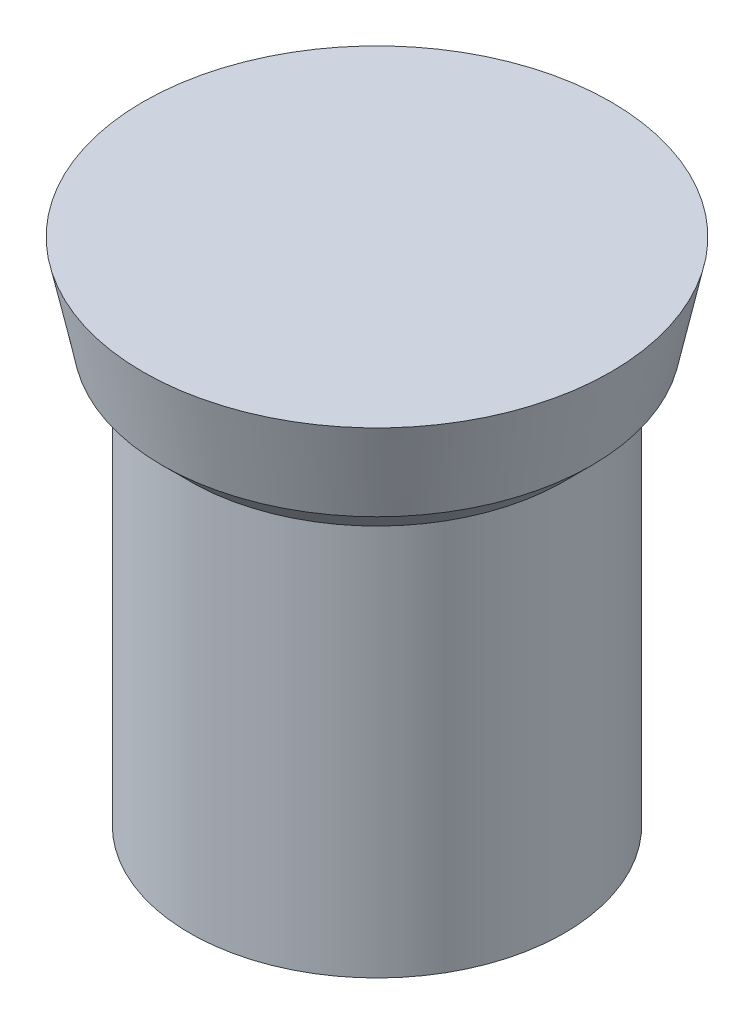
ISO-10303-21;
HEADER;
FILE_DESCRIPTION(('STEP AP214'),'2;1');
FILE_NAME('part.step','',(''),(''),'','','');
FILE_SCHEMA(('AUTOMOTIVE_DESIGN { 1 0 10303 214 1 1 1 1 }'));
ENDSEC;
DATA;
#1=APPLICATION_CONTEXT('core data for automotive mechanical design processes');
#2=APPLICATION_PROTOCOL_DEFINITION('international standard','automotive_design',2000,#1);
#3=PRODUCT_CONTEXT('',#1,'mechanical');
#4=PRODUCT('Part','Part','',(#3));
#5=PRODUCT_RELATED_PRODUCT_CATEGORY('part','',(#4));
#6=PRODUCT_DEFINITION_FORMATION('','',#4);
#7=PRODUCT_DEFINITION_CONTEXT('part definition',#1,'design');
#8=PRODUCT_DEFINITION('design','',#6,#7);
#9=PRODUCT_DEFINITION_SHAPE('','',#8);
#10=(LENGTH_UNIT() NAMED_UNIT(*) SI_UNIT(.MILLI.,.METRE.));
#11=(NAMED_UNIT(*) PLANE_ANGLE_UNIT() SI_UNIT($,.RADIAN.));
#12=(NAMED_UNIT(*) SI_UNIT($,.STERADIAN.) SOLID_ANGLE_UNIT());
#13=UNCERTAINTY_MEASURE_WITH_UNIT(LENGTH_MEASURE(1.E-05),#10,'distance_accuracy_value','');
#14=(GEOMETRIC_REPRESENTATION_CONTEXT(3) GLOBAL_UNCERTAINTY_ASSIGNED_CONTEXT((#13)) GLOBAL_UNIT_ASSIGNED_CONTEXT((#10,
#11,#12)) REPRESENTATION_CONTEXT('',''));
#15=CARTESIAN_POINT('',(0.,0.,0.));
#16=DIRECTION('',(0.,0.,1.));
#17=DIRECTION('',(1.,0.,0.));
#18=AXIS2_PLACEMENT_3D('',#15,#16,#17);
#19=CARTESIAN_POINT('',(0.,0.,0.));
#20=DIRECTION('',(0.,-1.,0.));
#21=DIRECTION('',(0.,0.,-1.));
#22=AXIS2_PLACEMENT_3D('',#19,#20,#21);
#23=PLANE('',#22);
#24=CARTESIAN_POINT('',(0.,0.,0.));
#25=DIRECTION('',(0.,-1.,0.));
#26=DIRECTION('',(0.,0.,-1.));
#27=AXIS2_PLACEMENT_3D('',#24,#25,#26);
#28=CIRCLE('',#27,4.9609375);
#29=CARTESIAN_POINT('',(0.,0.,-4.9609375));
#30=VERTEX_POINT('',#29);
#31=EDGE_CURVE('E10',#30,#30,#28,.T.);
#32=ORIENTED_EDGE('',*,*,#31,.T.);
#33=EDGE_LOOP('',(#32));
#34=FACE_BOUND('',#33,.T.);
#35=ADVANCED_FACE('F33',(#34),#23,.T.);
#36=CARTESIAN_POINT('',(0.,0.,0.));
#37=DIRECTION('',(0.,-1.,0.));
#38=DIRECTION('',(0.,0.,-1.));
#39=AXIS2_PLACEMENT_3D('',#36,#37,#38);
#40=CYLINDRICAL_SURFACE('',#39,4.9609375);
#41=CARTESIAN_POINT('',(0.,10.3710732480081,0.));
#42=DIRECTION('',(0.,-1.,0.));
#43=DIRECTION('',(0.,0.,-1.));
#44=AXIS2_PLACEMENT_3D('',#41,#42,#43);
#45=CIRCLE('',#44,4.9609375);
#46=CARTESIAN_POINT('',(0.,10.3710732480081,-4.9609375));
#47=VERTEX_POINT('',#46);
#48=EDGE_CURVE('E39',#47,#47,#45,.T.);
#49=ORIENTED_EDGE('',*,*,#48,.T.);
#50=EDGE_LOOP('',(#49));
#51=FACE_BOUND('',#50,.T.);
#52=ORIENTED_EDGE('',*,*,#31,.F.);
#53=EDGE_LOOP('',(#52));
#54=FACE_BOUND('',#53,.T.);
#55=ADVANCED_FACE('F65',(#51,#54),#40,.T.);
#56=CARTESIAN_POINT('',(0.,10.3710732480081,0.));
#57=DIRECTION('',(0.,1.,0.));
#58=DIRECTION('',(0.,0.,1.));
#59=AXIS2_PLACEMENT_3D('',#56,#57,#58);
#60=CONICAL_SURFACE('',#59,4.9609375,0.785398163397451);
#61=CARTESIAN_POINT('',(0.,11.1,0.));
#62=DIRECTION('',(0.,-1.,0.));
#63=DIRECTION('',(0.,0.,-1.));
#64=AXIS2_PLACEMENT_3D('',#61,#62,#63);
#65=CIRCLE('',#64,5.68986425199195);
#66=CARTESIAN_POINT('',(0.,11.1,-5.68986425199195));
#67=VERTEX_POINT('',#66);
#68=EDGE_CURVE('E43',#67,#67,#65,.T.);
#69=ORIENTED_EDGE('',*,*,#68,.T.);
#70=EDGE_LOOP('',(#69));
#71=FACE_BOUND('',#70,.T.);
#72=ORIENTED_EDGE('',*,*,#48,.F.);
#73=EDGE_LOOP('',(#72));
#74=FACE_BOUND('',#73,.T.);
#75=ADVANCED_FACE('F62',(#71,#74),#60,.T.);
#76=CARTESIAN_POINT('',(0.,11.1,0.));
#77=DIRECTION('',(0.,1.,0.));
#78=DIRECTION('',(0.,0.,1.));
#79=AXIS2_PLACEMENT_3D('',#76,#77,#78);
#80=CONICAL_SURFACE('',#79,5.68986425199195,0.20943951023932);
#81=CARTESIAN_POINT('',(0.,13.5,0.));
#82=DIRECTION('',(0.,-1.,0.));
#83=DIRECTION('',(0.,0.,-1.));
#84=AXIS2_PLACEMENT_3D('',#81,#82,#83);
#85=CIRCLE('',#84,6.2);
#86=CARTESIAN_POINT('',(0.,13.5,-6.2));
#87=VERTEX_POINT('',#86);
#88=EDGE_CURVE('E47',#87,#87,#85,.T.);
#89=ORIENTED_EDGE('',*,*,#88,.T.);
#90=EDGE_LOOP('',(#89));
#91=FACE_BOUND('',#90,.T.);
#92=ORIENTED_EDGE('',*,*,#68,.F.);
#93=EDGE_LOOP('',(#92));
#94=FACE_BOUND('',#93,.T.);
#95=ADVANCED_FACE('F53',(#91,#94),#80,.T.);
#96=CARTESIAN_POINT('',(0.,13.5,0.));
#97=DIRECTION('',(0.,1.,0.));
#98=DIRECTION('',(0.,0.,1.));
#99=AXIS2_PLACEMENT_3D('',#96,#97,#98);
#100=PLANE('',#99);
#101=ORIENTED_EDGE('',*,*,#88,.F.);
#102=EDGE_LOOP('',(#101));
#103=FACE_BOUND('',#102,.T.);
#104=ADVANCED_FACE('F56',(#103),#100,.T.);
#105=CLOSED_SHELL('',(#35,#55,#75,#95,#104));
#106=MANIFOLD_SOLID_BREP('B2',#105);
#107=ADVANCED_BREP_SHAPE_REPRESENTATION('',(#18,#106),#14);
#108=SHAPE_DEFINITION_REPRESENTATION(#9,#107);
ENDSEC;
END-ISO-10303-21;
